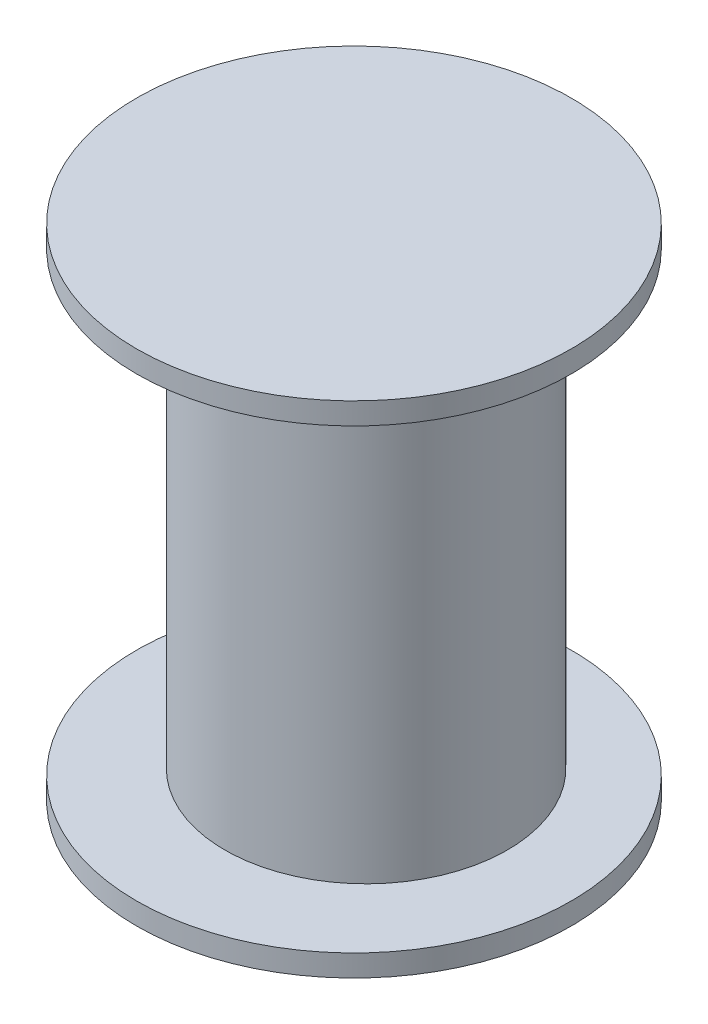
ISO-10303-21;
HEADER;
FILE_DESCRIPTION(('STEP AP214'),'2;1');
FILE_NAME('part.step','',(''),(''),'','','');
FILE_SCHEMA(('AUTOMOTIVE_DESIGN { 1 0 10303 214 1 1 1 1 }'));
ENDSEC;
DATA;
#1=APPLICATION_CONTEXT('core data for automotive mechanical design processes');
#2=APPLICATION_PROTOCOL_DEFINITION('international standard','automotive_design',2000,#1);
#3=PRODUCT_CONTEXT('',#1,'mechanical');
#4=PRODUCT('Part','Part','',(#3));
#5=PRODUCT_RELATED_PRODUCT_CATEGORY('part','',(#4));
#6=PRODUCT_DEFINITION_FORMATION('','',#4);
#7=PRODUCT_DEFINITION_CONTEXT('part definition',#1,'design');
#8=PRODUCT_DEFINITION('design','',#6,#7);
#9=PRODUCT_DEFINITION_SHAPE('','',#8);
#10=(LENGTH_UNIT() NAMED_UNIT(*) SI_UNIT(.MILLI.,.METRE.));
#11=(NAMED_UNIT(*) PLANE_ANGLE_UNIT() SI_UNIT($,.RADIAN.));
#12=(NAMED_UNIT(*) SI_UNIT($,.STERADIAN.) SOLID_ANGLE_UNIT());
#13=UNCERTAINTY_MEASURE_WITH_UNIT(LENGTH_MEASURE(1.E-05),#10,'distance_accuracy_value','');
#14=(GEOMETRIC_REPRESENTATION_CONTEXT(3) GLOBAL_UNCERTAINTY_ASSIGNED_CONTEXT((#13)) GLOBAL_UNIT_ASSIGNED_CONTEXT((#10,
#11,#12)) REPRESENTATION_CONTEXT('',''));
#15=CARTESIAN_POINT('',(0.,0.,0.));
#16=DIRECTION('',(0.,0.,1.));
#17=DIRECTION('',(1.,0.,0.));
#18=AXIS2_PLACEMENT_3D('',#15,#16,#17);
#19=CARTESIAN_POINT('',(0.,1.,0.));
#20=DIRECTION('',(0.,-1.,0.));
#21=DIRECTION('',(0.,0.,-1.));
#22=AXIS2_PLACEMENT_3D('',#19,#20,#21);
#23=CYLINDRICAL_SURFACE('',#22,10.);
#24=CARTESIAN_POINT('',(0.,1.,0.));
#25=DIRECTION('',(0.,1.,0.));
#26=DIRECTION('',(0.,0.,1.));
#27=AXIS2_PLACEMENT_3D('',#24,#25,#26);
#28=CIRCLE('',#27,10.);
#29=CARTESIAN_POINT('',(0.,1.,10.));
#30=VERTEX_POINT('',#29);
#31=EDGE_CURVE('E10',#30,#30,#28,.T.);
#32=ORIENTED_EDGE('',*,*,#31,.F.);
#33=EDGE_LOOP('',(#32));
#34=FACE_BOUND('',#33,.T.);
#35=CARTESIAN_POINT('',(0.,0.,0.));
#36=DIRECTION('',(0.,1.,0.));
#37=DIRECTION('',(0.,0.,1.));
#38=AXIS2_PLACEMENT_3D('',#35,#36,#37);
#39=CIRCLE('',#38,10.);
#40=CARTESIAN_POINT('',(0.,0.,10.));
#41=VERTEX_POINT('',#40);
#42=EDGE_CURVE('E34',#41,#41,#39,.T.);
#43=ORIENTED_EDGE('',*,*,#42,.T.);
#44=EDGE_LOOP('',(#43));
#45=FACE_BOUND('',#44,.T.);
#46=ADVANCED_FACE('F31',(#34,#45),#23,.T.);
#47=CARTESIAN_POINT('',(0.,1.,0.));
#48=DIRECTION('',(0.,1.,0.));
#49=DIRECTION('',(0.,0.,1.));
#50=AXIS2_PLACEMENT_3D('',#47,#48,#49);
#51=PLANE('',#50);
#52=CARTESIAN_POINT('',(0.,1.,-0.559439900825964));
#53=DIRECTION('',(0.,1.,0.));
#54=DIRECTION('',(0.,0.,1.));
#55=AXIS2_PLACEMENT_3D('',#52,#53,#54);
#56=CIRCLE('',#55,6.5);
#57=CARTESIAN_POINT('',(0.,1.,-7.05943990082596));
#58=VERTEX_POINT('',#57);
#59=EDGE_CURVE('E43',#58,#58,#56,.T.);
#60=ORIENTED_EDGE('',*,*,#59,.F.);
#61=EDGE_LOOP('',(#60));
#62=FACE_BOUND('',#61,.T.);
#63=ORIENTED_EDGE('',*,*,#31,.T.);
#64=EDGE_LOOP('',(#63));
#65=FACE_BOUND('',#64,.T.);
#66=ADVANCED_FACE('F73',(#62,#65),#51,.T.);
#67=CARTESIAN_POINT('',(0.,0.,0.));
#68=DIRECTION('',(0.,1.,0.));
#69=DIRECTION('',(0.,0.,1.));
#70=AXIS2_PLACEMENT_3D('',#67,#68,#69);
#71=PLANE('',#70);
#72=ORIENTED_EDGE('',*,*,#42,.F.);
#73=EDGE_LOOP('',(#72));
#74=FACE_BOUND('',#73,.T.);
#75=ADVANCED_FACE('F78',(#74),#71,.F.);
#76=CARTESIAN_POINT('',(0.,22.,-0.559439900825964));
#77=DIRECTION('',(0.,-1.,0.));
#78=DIRECTION('',(0.,0.,-1.));
#79=AXIS2_PLACEMENT_3D('',#76,#77,#78);
#80=CYLINDRICAL_SURFACE('',#79,6.5);
#81=CARTESIAN_POINT('',(0.,22.,-0.559439900825964));
#82=DIRECTION('',(0.,1.,0.));
#83=DIRECTION('',(0.,0.,1.));
#84=AXIS2_PLACEMENT_3D('',#81,#82,#83);
#85=CIRCLE('',#84,6.5);
#86=CARTESIAN_POINT('',(0.,22.,-7.05943990082596));
#87=VERTEX_POINT('',#86);
#88=EDGE_CURVE('E41',#87,#87,#85,.T.);
#89=CARTESIAN_POINT('',(0.,22.,-7.05943990082596));
#90=CARTESIAN_POINT('',(0.,21.78125,-7.05943990082596));
#91=CARTESIAN_POINT('',(0.,21.5625,-7.05943990082596));
#92=CARTESIAN_POINT('',(0.,21.125,-7.05943990082596));
#93=CARTESIAN_POINT('',(0.,20.90625,-7.05943990082596));
#94=CARTESIAN_POINT('',(0.,20.46875,-7.05943990082596));
#95=CARTESIAN_POINT('',(0.,20.25,-7.05943990082596));
#96=CARTESIAN_POINT('',(0.,19.8125,-7.05943990082596));
#97=CARTESIAN_POINT('',(0.,19.59375,-7.05943990082596));
#98=CARTESIAN_POINT('',(0.,19.15625,-7.05943990082596));
#99=CARTESIAN_POINT('',(0.,18.9375,-7.05943990082596));
#100=CARTESIAN_POINT('',(0.,18.5,-7.05943990082596));
#101=CARTESIAN_POINT('',(0.,18.28125,-7.05943990082596));
#102=CARTESIAN_POINT('',(0.,17.84375,-7.05943990082596));
#103=CARTESIAN_POINT('',(0.,17.625,-7.05943990082596));
#104=CARTESIAN_POINT('',(0.,17.1875,-7.05943990082596));
#105=CARTESIAN_POINT('',(0.,16.96875,-7.05943990082596));
#106=CARTESIAN_POINT('',(0.,16.53125,-7.05943990082596));
#107=CARTESIAN_POINT('',(0.,16.3125,-7.05943990082596));
#108=CARTESIAN_POINT('',(0.,15.875,-7.05943990082596));
#109=CARTESIAN_POINT('',(0.,15.65625,-7.05943990082596));
#110=CARTESIAN_POINT('',(0.,15.21875,-7.05943990082596));
#111=CARTESIAN_POINT('',(0.,15.,-7.05943990082596));
#112=CARTESIAN_POINT('',(0.,14.5625,-7.05943990082596));
#113=CARTESIAN_POINT('',(0.,14.34375,-7.05943990082596));
#114=CARTESIAN_POINT('',(0.,13.90625,-7.05943990082596));
#115=CARTESIAN_POINT('',(0.,13.6875,-7.05943990082596));
#116=CARTESIAN_POINT('',(0.,13.25,-7.05943990082596));
#117=CARTESIAN_POINT('',(0.,13.03125,-7.05943990082596));
#118=CARTESIAN_POINT('',(0.,12.59375,-7.05943990082596));
#119=CARTESIAN_POINT('',(0.,12.375,-7.05943990082596));
#120=CARTESIAN_POINT('',(0.,11.9375,-7.05943990082596));
#121=CARTESIAN_POINT('',(0.,11.71875,-7.05943990082596));
#122=CARTESIAN_POINT('',(0.,11.28125,-7.05943990082596));
#123=CARTESIAN_POINT('',(0.,11.0625,-7.05943990082596));
#124=CARTESIAN_POINT('',(0.,10.625,-7.05943990082596));
#125=CARTESIAN_POINT('',(0.,10.40625,-7.05943990082596));
#126=CARTESIAN_POINT('',(0.,9.96875,-7.05943990082596));
#127=CARTESIAN_POINT('',(0.,9.75,-7.05943990082596));
#128=CARTESIAN_POINT('',(0.,9.3125,-7.05943990082596));
#129=CARTESIAN_POINT('',(0.,9.09375,-7.05943990082596));
#130=CARTESIAN_POINT('',(0.,8.65625,-7.05943990082596));
#131=CARTESIAN_POINT('',(0.,8.4375,-7.05943990082596));
#132=CARTESIAN_POINT('',(0.,8.,-7.05943990082596));
#133=CARTESIAN_POINT('',(0.,7.78125,-7.05943990082596));
#134=CARTESIAN_POINT('',(0.,7.34375,-7.05943990082596));
#135=CARTESIAN_POINT('',(0.,7.125,-7.05943990082596));
#136=CARTESIAN_POINT('',(0.,6.6875,-7.05943990082596));
#137=CARTESIAN_POINT('',(0.,6.46875,-7.05943990082596));
#138=CARTESIAN_POINT('',(0.,6.03125,-7.05943990082596));
#139=CARTESIAN_POINT('',(0.,5.8125,-7.05943990082596));
#140=CARTESIAN_POINT('',(0.,5.375,-7.05943990082596));
#141=CARTESIAN_POINT('',(0.,5.15625,-7.05943990082596));
#142=CARTESIAN_POINT('',(0.,4.71875,-7.05943990082596));
#143=CARTESIAN_POINT('',(0.,4.5,-7.05943990082596));
#144=CARTESIAN_POINT('',(0.,4.0625,-7.05943990082596));
#145=CARTESIAN_POINT('',(0.,3.84375,-7.05943990082596));
#146=CARTESIAN_POINT('',(0.,3.40625,-7.05943990082596));
#147=CARTESIAN_POINT('',(0.,3.1875,-7.05943990082596));
#148=CARTESIAN_POINT('',(0.,2.75,-7.05943990082596));
#149=CARTESIAN_POINT('',(0.,2.53125,-7.05943990082596));
#150=CARTESIAN_POINT('',(0.,2.09375,-7.05943990082596));
#151=CARTESIAN_POINT('',(0.,1.875,-7.05943990082596));
#152=CARTESIAN_POINT('',(0.,1.4375,-7.05943990082596));
#153=CARTESIAN_POINT('',(0.,1.21875,-7.05943990082596));
#154=CARTESIAN_POINT('',(0.,1.,-7.05943990082596));
#155=B_SPLINE_CURVE_WITH_KNOTS('',3,(#89,#90,#91,#92,#93,#94,#95,#96,#97,#98,#99,#100,#101,#102,
#103,#104,#105,#106,#107,#108,#109,#110,#111,#112,#113,#114,#115,#116,#117,#118,#119,#120,#121,
#122,#123,#124,#125,#126,#127,#128,#129,#130,#131,#132,#133,#134,#135,#136,#137,#138,#139,#140,
#141,#142,#143,#144,#145,#146,#147,#148,#149,#150,#151,#152,#153,#154),.UNSPECIFIED.,.F.,.F.,(4,
2,2,2,2,2,2,2,2,2,2,2,2,2,2,2,2,2,2,2,2,2,2,2,2,2,2,2,2,2,2,2,4),(0.,0.656250000000001,1.3125,
1.96875,2.625,3.28125,3.9375,4.59375,5.25,5.90625,6.5625,7.21875,7.875,8.53125,9.1875,9.84375,
10.5,11.15625,11.8125,12.46875,13.125,13.78125,14.4375,15.09375,15.75,16.40625,17.0625,17.71875,
18.375,19.03125,19.6875,20.34375,21.),.UNSPECIFIED.);
#156=EDGE_CURVE('BSEAM60',#87,#58,#155,.T.);
#157=ORIENTED_EDGE('',*,*,#88,.F.);
#158=ORIENTED_EDGE('',*,*,#59,.T.);
#159=ORIENTED_EDGE('',*,*,#156,.T.);
#160=ORIENTED_EDGE('',*,*,#156,.F.);
#161=EDGE_LOOP('',(#157,#159,#158,#160));
#162=FACE_BOUND('',#161,.T.);
#163=ADVANCED_FACE('F60',(#162),#80,.T.);
#164=CARTESIAN_POINT('',(0.,23.,0.));
#165=DIRECTION('',(0.,-1.,0.));
#166=DIRECTION('',(0.,0.,-1.));
#167=AXIS2_PLACEMENT_3D('',#164,#165,#166);
#168=CYLINDRICAL_SURFACE('',#167,9.99999999999999);
#169=CARTESIAN_POINT('',(0.,23.,0.));
#170=DIRECTION('',(0.,1.,0.));
#171=DIRECTION('',(0.,0.,1.));
#172=AXIS2_PLACEMENT_3D('',#169,#170,#171);
#173=CIRCLE('',#172,9.99999999999999);
#174=CARTESIAN_POINT('',(0.,23.,9.99999999999999));
#175=VERTEX_POINT('',#174);
#176=EDGE_CURVE('E46',#175,#175,#173,.T.);
#177=ORIENTED_EDGE('',*,*,#176,.F.);
#178=EDGE_LOOP('',(#177));
#179=FACE_BOUND('',#178,.T.);
#180=CARTESIAN_POINT('',(0.,22.,0.));
#181=DIRECTION('',(0.,1.,0.));
#182=DIRECTION('',(0.,0.,1.));
#183=AXIS2_PLACEMENT_3D('',#180,#181,#182);
#184=CIRCLE('',#183,9.99999999999999);
#185=CARTESIAN_POINT('',(0.,22.,9.99999999999999));
#186=VERTEX_POINT('',#185);
#187=EDGE_CURVE('E49',#186,#186,#184,.T.);
#188=ORIENTED_EDGE('',*,*,#187,.T.);
#189=EDGE_LOOP('',(#188));
#190=FACE_BOUND('',#189,.T.);
#191=ADVANCED_FACE('F57',(#179,#190),#168,.T.);
#192=CARTESIAN_POINT('',(0.,23.,0.));
#193=DIRECTION('',(0.,1.,0.));
#194=DIRECTION('',(0.,0.,1.));
#195=AXIS2_PLACEMENT_3D('',#192,#193,#194);
#196=PLANE('',#195);
#197=ORIENTED_EDGE('',*,*,#176,.T.);
#198=EDGE_LOOP('',(#197));
#199=FACE_BOUND('',#198,.T.);
#200=ADVANCED_FACE('F55',(#199),#196,.T.);
#201=CARTESIAN_POINT('',(0.,22.,0.));
#202=DIRECTION('',(0.,1.,0.));
#203=DIRECTION('',(0.,0.,1.));
#204=AXIS2_PLACEMENT_3D('',#201,#202,#203);
#205=PLANE('',#204);
#206=ORIENTED_EDGE('',*,*,#88,.T.);
#207=EDGE_LOOP('',(#206));
#208=FACE_BOUND('',#207,.T.);
#209=ORIENTED_EDGE('',*,*,#187,.F.);
#210=EDGE_LOOP('',(#209));
#211=FACE_BOUND('',#210,.T.);
#212=ADVANCED_FACE('F64',(#208,#211),#205,.F.);
#213=CLOSED_SHELL('',(#46,#66,#75,#163,#191,#200,#212));
#214=MANIFOLD_SOLID_BREP('B2',#213);
#215=ADVANCED_BREP_SHAPE_REPRESENTATION('',(#18,#214),#14);
#216=SHAPE_DEFINITION_REPRESENTATION(#9,#215);
ENDSEC;
END-ISO-10303-21;
